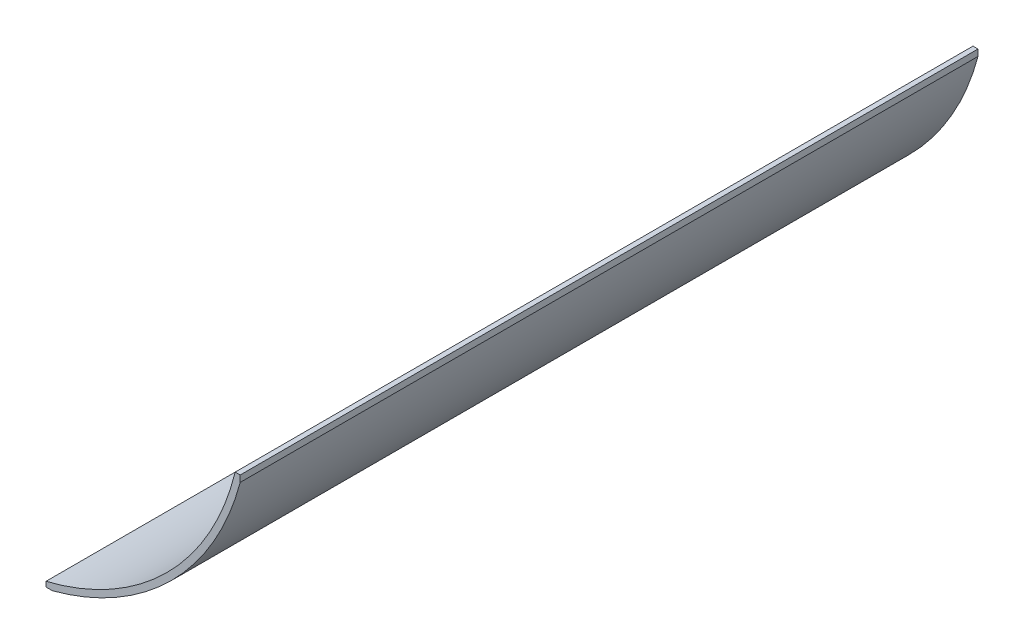
ISO-10303-21;
HEADER;
FILE_DESCRIPTION(('STEP AP214'),'2;1');
FILE_NAME('part.step','',(''),(''),'','','');
FILE_SCHEMA(('AUTOMOTIVE_DESIGN { 1 0 10303 214 1 1 1 1 }'));
ENDSEC;
DATA;
#1=APPLICATION_CONTEXT('core data for automotive mechanical design processes');
#2=APPLICATION_PROTOCOL_DEFINITION('international standard','automotive_design',2000,#1);
#3=PRODUCT_CONTEXT('',#1,'mechanical');
#4=PRODUCT('Part','Part','',(#3));
#5=PRODUCT_RELATED_PRODUCT_CATEGORY('part','',(#4));
#6=PRODUCT_DEFINITION_FORMATION('','',#4);
#7=PRODUCT_DEFINITION_CONTEXT('part definition',#1,'design');
#8=PRODUCT_DEFINITION('design','',#6,#7);
#9=PRODUCT_DEFINITION_SHAPE('','',#8);
#10=(LENGTH_UNIT() NAMED_UNIT(*) SI_UNIT(.MILLI.,.METRE.));
#11=(NAMED_UNIT(*) PLANE_ANGLE_UNIT() SI_UNIT($,.RADIAN.));
#12=(NAMED_UNIT(*) SI_UNIT($,.STERADIAN.) SOLID_ANGLE_UNIT());
#13=UNCERTAINTY_MEASURE_WITH_UNIT(LENGTH_MEASURE(1.E-05),#10,'distance_accuracy_value','');
#14=(GEOMETRIC_REPRESENTATION_CONTEXT(3) GLOBAL_UNCERTAINTY_ASSIGNED_CONTEXT((#13)) GLOBAL_UNIT_ASSIGNED_CONTEXT((#10,
#11,#12)) REPRESENTATION_CONTEXT('',''));
#15=CARTESIAN_POINT('',(0.,0.,0.));
#16=DIRECTION('',(0.,0.,1.));
#17=DIRECTION('',(1.,0.,0.));
#18=AXIS2_PLACEMENT_3D('',#15,#16,#17);
#19=CARTESIAN_POINT('',(0.,0.,-3.));
#20=DIRECTION('',(0.,0.,1.));
#21=DIRECTION('',(1.,0.,0.));
#22=AXIS2_PLACEMENT_3D('',#19,#20,#21);
#23=CYLINDRICAL_SURFACE('',#22,40.);
#24=CARTESIAN_POINT('',(0.,0.,111.5));
#25=DIRECTION('',(0.,0.,-1.));
#26=DIRECTION('',(-1.,0.,0.));
#27=AXIS2_PLACEMENT_3D('',#24,#25,#26);
#28=CIRCLE('',#27,40.);
#29=CARTESIAN_POINT('',(38.8555015409659,-9.49999999999995,111.5));
#30=VERTEX_POINT('',#29);
#31=CARTESIAN_POINT('',(9.50000000000006,-38.8555015409658,111.5));
#32=VERTEX_POINT('',#31);
#33=EDGE_CURVE('E118',#30,#32,#28,.T.);
#34=ORIENTED_EDGE('',*,*,#33,.F.);
#35=DIRECTION('',(0.,0.,1.));
#36=VECTOR('',#35,1.);
#37=CARTESIAN_POINT('',(38.8555015409659,-9.49999999999995,-3.));
#38=LINE('',#37,#36);
#39=CARTESIAN_POINT('',(38.8555015409659,-9.49999999999995,-3.));
#40=VERTEX_POINT('',#39);
#41=EDGE_CURVE('E11',#40,#30,#38,.T.);
#42=ORIENTED_EDGE('',*,*,#41,.F.);
#43=CARTESIAN_POINT('',(0.,0.,-3.));
#44=DIRECTION('',(0.,0.,-1.));
#45=DIRECTION('',(-1.,0.,0.));
#46=AXIS2_PLACEMENT_3D('',#43,#44,#45);
#47=CIRCLE('',#46,40.);
#48=CARTESIAN_POINT('',(9.50000000000006,-38.8555015409658,-3.));
#49=VERTEX_POINT('',#48);
#50=EDGE_CURVE('E132',#40,#49,#47,.T.);
#51=ORIENTED_EDGE('',*,*,#50,.T.);
#52=DIRECTION('',(0.,0.,1.));
#53=VECTOR('',#52,1.);
#54=CARTESIAN_POINT('',(9.50000000000006,-38.8555015409658,-3.));
#55=LINE('',#54,#53);
#56=EDGE_CURVE('E36',#49,#32,#55,.T.);
#57=ORIENTED_EDGE('',*,*,#56,.T.);
#58=EDGE_LOOP('',(#34,#42,#51,#57));
#59=FACE_BOUND('',#58,.T.);
#60=ADVANCED_FACE('F33',(#59),#23,.F.);
#61=CARTESIAN_POINT('',(39.6326885285367,-9.49999999999996,-3.));
#62=DIRECTION('',(0.,1.,0.));
#63=DIRECTION('',(-1.,0.,0.));
#64=AXIS2_PLACEMENT_3D('',#61,#62,#63);
#65=PLANE('',#64);
#66=DIRECTION('',(-1.,0.,0.));
#67=VECTOR('',#66,1.);
#68=CARTESIAN_POINT('',(39.6326885285367,-9.49999999999996,111.5));
#69=LINE('',#68,#67);
#70=CARTESIAN_POINT('',(39.6326885285367,-9.49999999999996,111.5));
#71=VERTEX_POINT('',#70);
#72=EDGE_CURVE('E130',#71,#30,#69,.T.);
#73=ORIENTED_EDGE('',*,*,#72,.F.);
#74=DIRECTION('',(0.,0.,1.));
#75=VECTOR('',#74,1.);
#76=CARTESIAN_POINT('',(39.6326885285367,-9.49999999999996,-3.));
#77=LINE('',#76,#75);
#78=CARTESIAN_POINT('',(39.6326885285367,-9.49999999999996,-3.));
#79=VERTEX_POINT('',#78);
#80=EDGE_CURVE('E42',#79,#71,#77,.T.);
#81=ORIENTED_EDGE('',*,*,#80,.F.);
#82=DIRECTION('',(-1.,0.,0.));
#83=VECTOR('',#82,1.);
#84=CARTESIAN_POINT('',(39.6326885285367,-9.49999999999996,-3.));
#85=LINE('',#84,#83);
#86=EDGE_CURVE('E108',#79,#40,#85,.T.);
#87=ORIENTED_EDGE('',*,*,#86,.T.);
#88=ORIENTED_EDGE('',*,*,#41,.T.);
#89=EDGE_LOOP('',(#73,#81,#87,#88));
#90=FACE_BOUND('',#89,.T.);
#91=ADVANCED_FACE('F140',(#90),#65,.T.);
#92=CARTESIAN_POINT('',(39.6326885285367,-10.4999999999999,-3.));
#93=DIRECTION('',(1.,0.,0.));
#94=DIRECTION('',(0.,1.,0.));
#95=AXIS2_PLACEMENT_3D('',#92,#93,#94);
#96=PLANE('',#95);
#97=DIRECTION('',(0.,1.,0.));
#98=VECTOR('',#97,1.);
#99=CARTESIAN_POINT('',(39.6326885285367,-10.4999999999999,111.5));
#100=LINE('',#99,#98);
#101=CARTESIAN_POINT('',(39.6326885285367,-10.4999999999999,111.5));
#102=VERTEX_POINT('',#101);
#103=EDGE_CURVE('E95',#102,#71,#100,.T.);
#104=ORIENTED_EDGE('',*,*,#103,.F.);
#105=DIRECTION('',(0.,0.,1.));
#106=VECTOR('',#105,1.);
#107=CARTESIAN_POINT('',(39.6326885285367,-10.4999999999999,-3.));
#108=LINE('',#107,#106);
#109=CARTESIAN_POINT('',(39.6326885285367,-10.4999999999999,-3.));
#110=VERTEX_POINT('',#109);
#111=EDGE_CURVE('E90',#110,#102,#108,.T.);
#112=ORIENTED_EDGE('',*,*,#111,.F.);
#113=DIRECTION('',(0.,1.,0.));
#114=VECTOR('',#113,1.);
#115=CARTESIAN_POINT('',(39.6326885285367,-10.4999999999999,-3.));
#116=LINE('',#115,#114);
#117=EDGE_CURVE('E93',#110,#79,#116,.T.);
#118=ORIENTED_EDGE('',*,*,#117,.T.);
#119=ORIENTED_EDGE('',*,*,#80,.T.);
#120=EDGE_LOOP('',(#104,#112,#118,#119));
#121=FACE_BOUND('',#120,.T.);
#122=ADVANCED_FACE('F92',(#121),#96,.T.);
#123=CARTESIAN_POINT('',(0.,0.,-3.));
#124=DIRECTION('',(0.,0.,1.));
#125=DIRECTION('',(1.,0.,0.));
#126=AXIS2_PLACEMENT_3D('',#123,#124,#125);
#127=CYLINDRICAL_SURFACE('',#126,41.);
#128=CARTESIAN_POINT('',(0.,0.,111.5));
#129=DIRECTION('',(0.,0.,1.));
#130=DIRECTION('',(1.,0.,0.));
#131=AXIS2_PLACEMENT_3D('',#128,#129,#130);
#132=CIRCLE('',#131,41.);
#133=CARTESIAN_POINT('',(10.5000000000001,-39.6326885285366,111.5));
#134=VERTEX_POINT('',#133);
#135=EDGE_CURVE('E127',#134,#102,#132,.T.);
#136=ORIENTED_EDGE('',*,*,#135,.F.);
#137=DIRECTION('',(0.,0.,1.));
#138=VECTOR('',#137,1.);
#139=CARTESIAN_POINT('',(10.5000000000001,-39.6326885285366,-3.));
#140=LINE('',#139,#138);
#141=CARTESIAN_POINT('',(10.5000000000001,-39.6326885285366,-3.));
#142=VERTEX_POINT('',#141);
#143=EDGE_CURVE('E100',#142,#134,#140,.T.);
#144=ORIENTED_EDGE('',*,*,#143,.F.);
#145=CARTESIAN_POINT('',(0.,0.,-3.));
#146=DIRECTION('',(0.,0.,1.));
#147=DIRECTION('',(1.,0.,0.));
#148=AXIS2_PLACEMENT_3D('',#145,#146,#147);
#149=CIRCLE('',#148,41.);
#150=EDGE_CURVE('E106',#142,#110,#149,.T.);
#151=ORIENTED_EDGE('',*,*,#150,.T.);
#152=ORIENTED_EDGE('',*,*,#111,.T.);
#153=EDGE_LOOP('',(#136,#144,#151,#152));
#154=FACE_BOUND('',#153,.T.);
#155=ADVANCED_FACE('F110',(#154),#127,.T.);
#156=CARTESIAN_POINT('',(9.50000000000004,-39.6326885285366,-3.));
#157=DIRECTION('',(0.,-1.,0.));
#158=DIRECTION('',(1.,0.,0.));
#159=AXIS2_PLACEMENT_3D('',#156,#157,#158);
#160=PLANE('',#159);
#161=DIRECTION('',(1.,0.,0.));
#162=VECTOR('',#161,1.);
#163=CARTESIAN_POINT('',(9.50000000000004,-39.6326885285366,111.5));
#164=LINE('',#163,#162);
#165=CARTESIAN_POINT('',(9.50000000000004,-39.6326885285366,111.5));
#166=VERTEX_POINT('',#165);
#167=EDGE_CURVE('E124',#166,#134,#164,.T.);
#168=ORIENTED_EDGE('',*,*,#167,.F.);
#169=DIRECTION('',(0.,0.,1.));
#170=VECTOR('',#169,1.);
#171=CARTESIAN_POINT('',(9.50000000000004,-39.6326885285366,-3.));
#172=LINE('',#171,#170);
#173=CARTESIAN_POINT('',(9.50000000000004,-39.6326885285366,-3.));
#174=VERTEX_POINT('',#173);
#175=EDGE_CURVE('E135',#174,#166,#172,.T.);
#176=ORIENTED_EDGE('',*,*,#175,.F.);
#177=DIRECTION('',(1.,0.,0.));
#178=VECTOR('',#177,1.);
#179=CARTESIAN_POINT('',(9.50000000000004,-39.6326885285366,-3.));
#180=LINE('',#179,#178);
#181=EDGE_CURVE('E111',#174,#142,#180,.T.);
#182=ORIENTED_EDGE('',*,*,#181,.T.);
#183=ORIENTED_EDGE('',*,*,#143,.T.);
#184=EDGE_LOOP('',(#168,#176,#182,#183));
#185=FACE_BOUND('',#184,.T.);
#186=ADVANCED_FACE('F153',(#185),#160,.T.);
#187=CARTESIAN_POINT('',(9.50000000000006,-38.8555015409658,-3.));
#188=DIRECTION('',(-1.,0.,0.));
#189=DIRECTION('',(0.,-1.,0.));
#190=AXIS2_PLACEMENT_3D('',#187,#188,#189);
#191=PLANE('',#190);
#192=DIRECTION('',(0.,-1.,0.));
#193=VECTOR('',#192,1.);
#194=CARTESIAN_POINT('',(9.50000000000006,-38.8555015409658,111.5));
#195=LINE('',#194,#193);
#196=EDGE_CURVE('E121',#32,#166,#195,.T.);
#197=ORIENTED_EDGE('',*,*,#196,.F.);
#198=ORIENTED_EDGE('',*,*,#56,.F.);
#199=DIRECTION('',(0.,-1.,0.));
#200=VECTOR('',#199,1.);
#201=CARTESIAN_POINT('',(9.50000000000006,-38.8555015409658,-3.));
#202=LINE('',#201,#200);
#203=EDGE_CURVE('E113',#49,#174,#202,.T.);
#204=ORIENTED_EDGE('',*,*,#203,.T.);
#205=ORIENTED_EDGE('',*,*,#175,.T.);
#206=EDGE_LOOP('',(#197,#198,#204,#205));
#207=FACE_BOUND('',#206,.T.);
#208=ADVANCED_FACE('F137',(#207),#191,.T.);
#209=CARTESIAN_POINT('',(0.,0.,-3.));
#210=DIRECTION('',(0.,0.,-1.));
#211=DIRECTION('',(-1.,0.,0.));
#212=AXIS2_PLACEMENT_3D('',#209,#210,#211);
#213=PLANE('',#212);
#214=ORIENTED_EDGE('',*,*,#50,.F.);
#215=ORIENTED_EDGE('',*,*,#86,.F.);
#216=ORIENTED_EDGE('',*,*,#117,.F.);
#217=ORIENTED_EDGE('',*,*,#150,.F.);
#218=ORIENTED_EDGE('',*,*,#181,.F.);
#219=ORIENTED_EDGE('',*,*,#203,.F.);
#220=EDGE_LOOP('',(#214,#215,#216,#217,#218,#219));
#221=FACE_BOUND('',#220,.T.);
#222=ADVANCED_FACE('F104',(#221),#213,.T.);
#223=CARTESIAN_POINT('',(0.,0.,111.5));
#224=DIRECTION('',(0.,0.,-1.));
#225=DIRECTION('',(-1.,0.,0.));
#226=AXIS2_PLACEMENT_3D('',#223,#224,#225);
#227=PLANE('',#226);
#228=ORIENTED_EDGE('',*,*,#33,.T.);
#229=ORIENTED_EDGE('',*,*,#196,.T.);
#230=ORIENTED_EDGE('',*,*,#167,.T.);
#231=ORIENTED_EDGE('',*,*,#135,.T.);
#232=ORIENTED_EDGE('',*,*,#103,.T.);
#233=ORIENTED_EDGE('',*,*,#72,.T.);
#234=EDGE_LOOP('',(#228,#229,#230,#231,#232,#233));
#235=FACE_BOUND('',#234,.T.);
#236=ADVANCED_FACE('F139',(#235),#227,.F.);
#237=CLOSED_SHELL('',(#60,#91,#122,#155,#186,#208,#222,#236));
#238=MANIFOLD_SOLID_BREP('B2',#237);
#239=ADVANCED_BREP_SHAPE_REPRESENTATION('',(#18,#238),#14);
#240=SHAPE_DEFINITION_REPRESENTATION(#9,#239);
ENDSEC;
END-ISO-10303-21;
